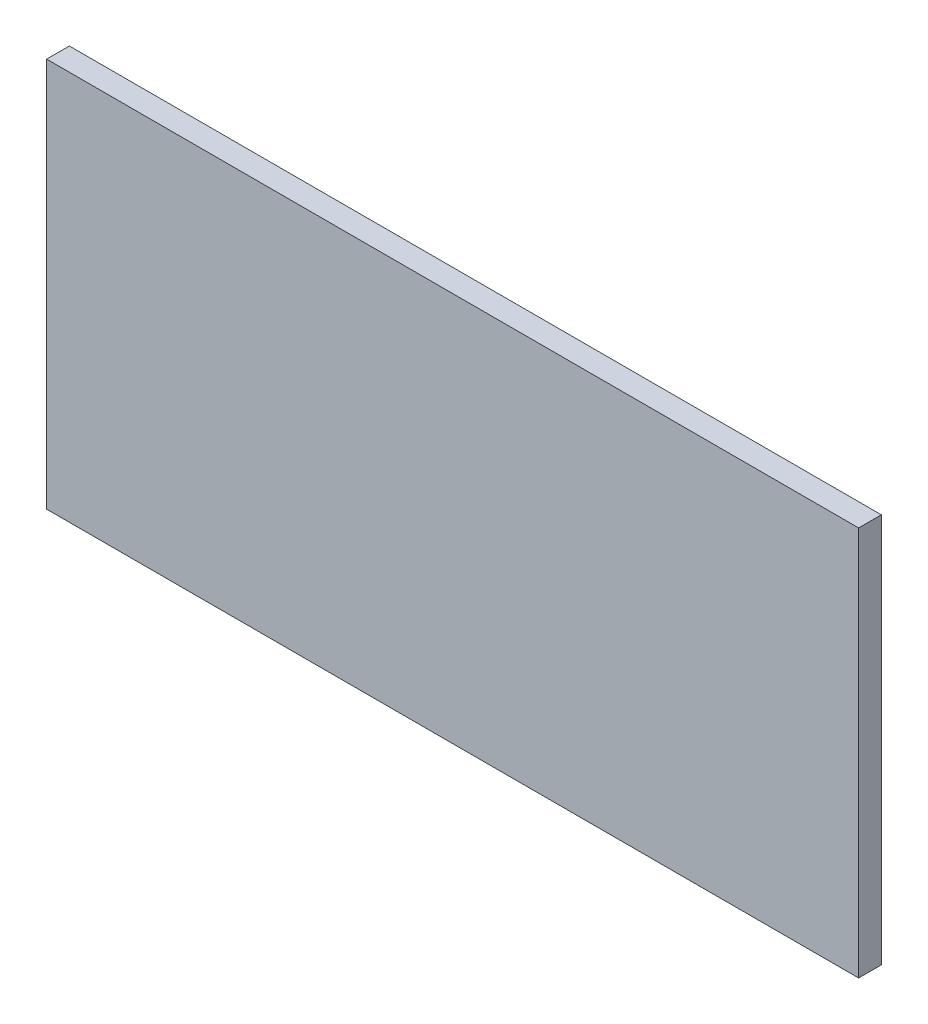
ISO-10303-21;
HEADER;
FILE_DESCRIPTION(('STEP AP214'),'2;1');
FILE_NAME('part.step','',(''),(''),'','','');
FILE_SCHEMA(('AUTOMOTIVE_DESIGN { 1 0 10303 214 1 1 1 1 }'));
ENDSEC;
DATA;
#1=APPLICATION_CONTEXT('core data for automotive mechanical design processes');
#2=APPLICATION_PROTOCOL_DEFINITION('international standard','automotive_design',2000,#1);
#3=PRODUCT_CONTEXT('',#1,'mechanical');
#4=PRODUCT('Part','Part','',(#3));
#5=PRODUCT_RELATED_PRODUCT_CATEGORY('part','',(#4));
#6=PRODUCT_DEFINITION_FORMATION('','',#4);
#7=PRODUCT_DEFINITION_CONTEXT('part definition',#1,'design');
#8=PRODUCT_DEFINITION('design','',#6,#7);
#9=PRODUCT_DEFINITION_SHAPE('','',#8);
#10=(LENGTH_UNIT() NAMED_UNIT(*) SI_UNIT(.MILLI.,.METRE.));
#11=(NAMED_UNIT(*) PLANE_ANGLE_UNIT() SI_UNIT($,.RADIAN.));
#12=(NAMED_UNIT(*) SI_UNIT($,.STERADIAN.) SOLID_ANGLE_UNIT());
#13=UNCERTAINTY_MEASURE_WITH_UNIT(LENGTH_MEASURE(1.E-05),#10,'distance_accuracy_value','');
#14=(GEOMETRIC_REPRESENTATION_CONTEXT(3) GLOBAL_UNCERTAINTY_ASSIGNED_CONTEXT((#13)) GLOBAL_UNIT_ASSIGNED_CONTEXT((#10,
#11,#12)) REPRESENTATION_CONTEXT('',''));
#15=CARTESIAN_POINT('',(0.,0.,0.));
#16=DIRECTION('',(0.,0.,1.));
#17=DIRECTION('',(1.,0.,0.));
#18=AXIS2_PLACEMENT_3D('',#15,#16,#17);
#19=CARTESIAN_POINT('',(76.835,-127.91,1.635));
#20=DIRECTION('',(0.,0.,-1.));
#21=DIRECTION('',(0.,-1.,0.));
#22=AXIS2_PLACEMENT_3D('',#19,#20,#21);
#23=PLANE('',#22);
#24=DIRECTION('',(0.,-1.,0.));
#25=VECTOR('',#24,1.);
#26=CARTESIAN_POINT('',(77.46,-127.61,1.635));
#27=LINE('',#26,#25);
#28=CARTESIAN_POINT('',(77.46,-127.61,1.635));
#29=VERTEX_POINT('',#28);
#30=CARTESIAN_POINT('',(77.46,-128.21,1.635));
#31=VERTEX_POINT('',#30);
#32=EDGE_CURVE('E26',#29,#31,#27,.T.);
#33=ORIENTED_EDGE('',*,*,#32,.F.);
#34=DIRECTION('',(1.,0.,0.));
#35=VECTOR('',#34,1.);
#36=CARTESIAN_POINT('',(76.21,-127.61,1.635));
#37=LINE('',#36,#35);
#38=CARTESIAN_POINT('',(76.21,-127.61,1.635));
#39=VERTEX_POINT('',#38);
#40=EDGE_CURVE('E58',#39,#29,#37,.T.);
#41=ORIENTED_EDGE('',*,*,#40,.F.);
#42=DIRECTION('',(0.,1.,0.));
#43=VECTOR('',#42,1.);
#44=CARTESIAN_POINT('',(76.21,-128.21,1.635));
#45=LINE('',#44,#43);
#46=CARTESIAN_POINT('',(76.21,-128.21,1.635));
#47=VERTEX_POINT('',#46);
#48=EDGE_CURVE('E87',#47,#39,#45,.T.);
#49=ORIENTED_EDGE('',*,*,#48,.F.);
#50=DIRECTION('',(-1.,0.,0.));
#51=VECTOR('',#50,1.);
#52=CARTESIAN_POINT('',(77.46,-128.21,1.635));
#53=LINE('',#52,#51);
#54=EDGE_CURVE('E85',#31,#47,#53,.T.);
#55=ORIENTED_EDGE('',*,*,#54,.F.);
#56=EDGE_LOOP('',(#33,#41,#49,#55));
#57=FACE_BOUND('',#56,.T.);
#58=ADVANCED_FACE('F17',(#57),#23,.F.);
#59=CARTESIAN_POINT('',(76.835,-127.91,1.6));
#60=DIRECTION('',(0.,0.,-1.));
#61=DIRECTION('',(0.,-1.,0.));
#62=AXIS2_PLACEMENT_3D('',#59,#60,#61);
#63=PLANE('',#62);
#64=DIRECTION('',(-1.,0.,0.));
#65=VECTOR('',#64,1.);
#66=CARTESIAN_POINT('',(77.46,-128.21,1.6));
#67=LINE('',#66,#65);
#68=CARTESIAN_POINT('',(77.46,-128.21,1.6));
#69=VERTEX_POINT('',#68);
#70=CARTESIAN_POINT('',(76.21,-128.21,1.6));
#71=VERTEX_POINT('',#70);
#72=EDGE_CURVE('E95',#69,#71,#67,.T.);
#73=ORIENTED_EDGE('',*,*,#72,.T.);
#74=DIRECTION('',(0.,1.,0.));
#75=VECTOR('',#74,1.);
#76=CARTESIAN_POINT('',(76.21,-128.21,1.6));
#77=LINE('',#76,#75);
#78=CARTESIAN_POINT('',(76.21,-127.61,1.6));
#79=VERTEX_POINT('',#78);
#80=EDGE_CURVE('E68',#71,#79,#77,.T.);
#81=ORIENTED_EDGE('',*,*,#80,.T.);
#82=DIRECTION('',(1.,0.,0.));
#83=VECTOR('',#82,1.);
#84=CARTESIAN_POINT('',(76.21,-127.61,1.6));
#85=LINE('',#84,#83);
#86=CARTESIAN_POINT('',(77.46,-127.61,1.6));
#87=VERTEX_POINT('',#86);
#88=EDGE_CURVE('E49',#79,#87,#85,.T.);
#89=ORIENTED_EDGE('',*,*,#88,.T.);
#90=DIRECTION('',(0.,-1.,0.));
#91=VECTOR('',#90,1.);
#92=CARTESIAN_POINT('',(77.46,-127.61,1.6));
#93=LINE('',#92,#91);
#94=EDGE_CURVE('E11',#87,#69,#93,.T.);
#95=ORIENTED_EDGE('',*,*,#94,.T.);
#96=EDGE_LOOP('',(#73,#81,#89,#95));
#97=FACE_BOUND('',#96,.T.);
#98=ADVANCED_FACE('F138',(#97),#63,.T.);
#99=CARTESIAN_POINT('',(77.46,-127.61,1.6));
#100=DIRECTION('',(1.,0.,0.));
#101=DIRECTION('',(0.,1.,0.));
#102=AXIS2_PLACEMENT_3D('',#99,#100,#101);
#103=PLANE('',#102);
#104=DIRECTION('',(0.,0.,1.));
#105=VECTOR('',#104,1.);
#106=CARTESIAN_POINT('',(77.46,-127.61,1.6));
#107=LINE('',#106,#105);
#108=EDGE_CURVE('E82',#87,#29,#107,.T.);
#109=ORIENTED_EDGE('',*,*,#108,.T.);
#110=ORIENTED_EDGE('',*,*,#32,.T.);
#111=DIRECTION('',(0.,0.,1.));
#112=VECTOR('',#111,1.);
#113=CARTESIAN_POINT('',(77.46,-128.21,1.6));
#114=LINE('',#113,#112);
#115=EDGE_CURVE('E81',#69,#31,#114,.T.);
#116=ORIENTED_EDGE('',*,*,#115,.F.);
#117=ORIENTED_EDGE('',*,*,#94,.F.);
#118=EDGE_LOOP('',(#109,#110,#116,#117));
#119=FACE_BOUND('',#118,.T.);
#120=ADVANCED_FACE('F79',(#119),#103,.T.);
#121=CARTESIAN_POINT('',(76.21,-127.61,1.6));
#122=DIRECTION('',(0.,1.,0.));
#123=DIRECTION('',(1.,0.,0.));
#124=AXIS2_PLACEMENT_3D('',#121,#122,#123);
#125=PLANE('',#124);
#126=DIRECTION('',(0.,0.,1.));
#127=VECTOR('',#126,1.);
#128=CARTESIAN_POINT('',(76.21,-127.61,1.6));
#129=LINE('',#128,#127);
#130=EDGE_CURVE('E108',#79,#39,#129,.T.);
#131=ORIENTED_EDGE('',*,*,#130,.T.);
#132=ORIENTED_EDGE('',*,*,#40,.T.);
#133=ORIENTED_EDGE('',*,*,#108,.F.);
#134=ORIENTED_EDGE('',*,*,#88,.F.);
#135=EDGE_LOOP('',(#131,#132,#133,#134));
#136=FACE_BOUND('',#135,.T.);
#137=ADVANCED_FACE('F128',(#136),#125,.T.);
#138=CARTESIAN_POINT('',(76.21,-128.21,1.6));
#139=DIRECTION('',(-1.,0.,0.));
#140=DIRECTION('',(0.,0.,1.));
#141=AXIS2_PLACEMENT_3D('',#138,#139,#140);
#142=PLANE('',#141);
#143=DIRECTION('',(0.,0.,1.));
#144=VECTOR('',#143,1.);
#145=CARTESIAN_POINT('',(76.21,-128.21,1.6));
#146=LINE('',#145,#144);
#147=EDGE_CURVE('E91',#71,#47,#146,.T.);
#148=ORIENTED_EDGE('',*,*,#147,.T.);
#149=ORIENTED_EDGE('',*,*,#48,.T.);
#150=ORIENTED_EDGE('',*,*,#130,.F.);
#151=ORIENTED_EDGE('',*,*,#80,.F.);
#152=EDGE_LOOP('',(#148,#149,#150,#151));
#153=FACE_BOUND('',#152,.T.);
#154=ADVANCED_FACE('F127',(#153),#142,.T.);
#155=CARTESIAN_POINT('',(77.46,-128.21,1.6));
#156=DIRECTION('',(0.,-1.,0.));
#157=DIRECTION('',(0.,0.,-1.));
#158=AXIS2_PLACEMENT_3D('',#155,#156,#157);
#159=PLANE('',#158);
#160=ORIENTED_EDGE('',*,*,#115,.T.);
#161=ORIENTED_EDGE('',*,*,#54,.T.);
#162=ORIENTED_EDGE('',*,*,#147,.F.);
#163=ORIENTED_EDGE('',*,*,#72,.F.);
#164=EDGE_LOOP('',(#160,#161,#162,#163));
#165=FACE_BOUND('',#164,.T.);
#166=ADVANCED_FACE('F94',(#165),#159,.T.);
#167=CLOSED_SHELL('',(#58,#98,#120,#137,#154,#166));
#168=MANIFOLD_SOLID_BREP('B1',#167);
#169=ADVANCED_BREP_SHAPE_REPRESENTATION('',(#18,#168),#14);
#170=SHAPE_DEFINITION_REPRESENTATION(#9,#169);
ENDSEC;
END-ISO-10303-21;
